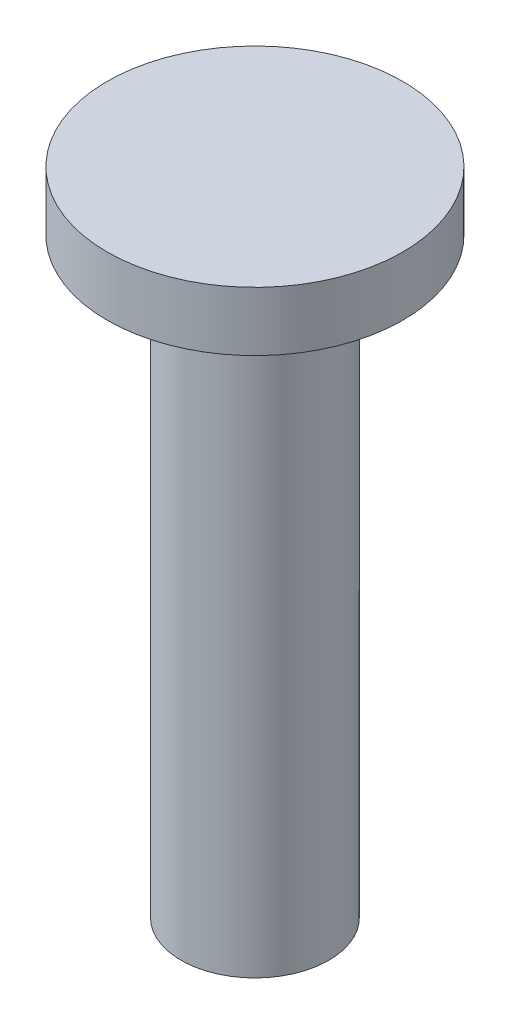
ISO-10303-21;
HEADER;
FILE_DESCRIPTION(('STEP AP214'),'2;1');
FILE_NAME('part.step','',(''),(''),'','','');
FILE_SCHEMA(('AUTOMOTIVE_DESIGN { 1 0 10303 214 1 1 1 1 }'));
ENDSEC;
DATA;
#1=APPLICATION_CONTEXT('core data for automotive mechanical design processes');
#2=APPLICATION_PROTOCOL_DEFINITION('international standard','automotive_design',2000,#1);
#3=PRODUCT_CONTEXT('',#1,'mechanical');
#4=PRODUCT('Part','Part','',(#3));
#5=PRODUCT_RELATED_PRODUCT_CATEGORY('part','',(#4));
#6=PRODUCT_DEFINITION_FORMATION('','',#4);
#7=PRODUCT_DEFINITION_CONTEXT('part definition',#1,'design');
#8=PRODUCT_DEFINITION('design','',#6,#7);
#9=PRODUCT_DEFINITION_SHAPE('','',#8);
#10=(LENGTH_UNIT() NAMED_UNIT(*) SI_UNIT(.MILLI.,.METRE.));
#11=(NAMED_UNIT(*) PLANE_ANGLE_UNIT() SI_UNIT($,.RADIAN.));
#12=(NAMED_UNIT(*) SI_UNIT($,.STERADIAN.) SOLID_ANGLE_UNIT());
#13=UNCERTAINTY_MEASURE_WITH_UNIT(LENGTH_MEASURE(1.E-05),#10,'distance_accuracy_value','');
#14=(GEOMETRIC_REPRESENTATION_CONTEXT(3) GLOBAL_UNCERTAINTY_ASSIGNED_CONTEXT((#13)) GLOBAL_UNIT_ASSIGNED_CONTEXT((#10,
#11,#12)) REPRESENTATION_CONTEXT('',''));
#15=CARTESIAN_POINT('',(0.,0.,0.));
#16=DIRECTION('',(0.,0.,1.));
#17=DIRECTION('',(1.,0.,0.));
#18=AXIS2_PLACEMENT_3D('',#15,#16,#17);
#19=CARTESIAN_POINT('',(0.,0.8,0.));
#20=DIRECTION('',(0.,-1.,0.));
#21=DIRECTION('',(0.,0.,-1.));
#22=AXIS2_PLACEMENT_3D('',#19,#20,#21);
#23=CYLINDRICAL_SURFACE('',#22,2.);
#24=CARTESIAN_POINT('',(0.,0.8,0.));
#25=DIRECTION('',(0.,1.,0.));
#26=DIRECTION('',(0.,0.,1.));
#27=AXIS2_PLACEMENT_3D('',#24,#25,#26);
#28=CIRCLE('',#27,2.);
#29=CARTESIAN_POINT('',(0.,0.8,2.));
#30=VERTEX_POINT('',#29);
#31=EDGE_CURVE('E46',#30,#30,#28,.T.);
#32=ORIENTED_EDGE('',*,*,#31,.F.);
#33=EDGE_LOOP('',(#32));
#34=FACE_BOUND('',#33,.T.);
#35=CARTESIAN_POINT('',(0.,0.,0.));
#36=DIRECTION('',(0.,1.,0.));
#37=DIRECTION('',(0.,0.,1.));
#38=AXIS2_PLACEMENT_3D('',#35,#36,#37);
#39=CIRCLE('',#38,2.);
#40=CARTESIAN_POINT('',(0.,0.,2.));
#41=VERTEX_POINT('',#40);
#42=EDGE_CURVE('E42',#41,#41,#39,.T.);
#43=ORIENTED_EDGE('',*,*,#42,.T.);
#44=EDGE_LOOP('',(#43));
#45=FACE_BOUND('',#44,.T.);
#46=ADVANCED_FACE('F39',(#34,#45),#23,.T.);
#47=CARTESIAN_POINT('',(0.,0.8,0.));
#48=DIRECTION('',(0.,1.,0.));
#49=DIRECTION('',(0.,0.,1.));
#50=AXIS2_PLACEMENT_3D('',#47,#48,#49);
#51=PLANE('',#50);
#52=ORIENTED_EDGE('',*,*,#31,.T.);
#53=EDGE_LOOP('',(#52));
#54=FACE_BOUND('',#53,.T.);
#55=ADVANCED_FACE('F63',(#54),#51,.T.);
#56=CARTESIAN_POINT('',(0.,0.,0.));
#57=DIRECTION('',(0.,1.,0.));
#58=DIRECTION('',(0.,0.,1.));
#59=AXIS2_PLACEMENT_3D('',#56,#57,#58);
#60=PLANE('',#59);
#61=CARTESIAN_POINT('',(0.,0.,0.));
#62=DIRECTION('',(0.,-1.,0.));
#63=DIRECTION('',(0.,0.,-1.));
#64=AXIS2_PLACEMENT_3D('',#61,#62,#63);
#65=CIRCLE('',#64,1.);
#66=CARTESIAN_POINT('',(0.,0.,-1.));
#67=VERTEX_POINT('',#66);
#68=EDGE_CURVE('E10',#67,#67,#65,.T.);
#69=ORIENTED_EDGE('',*,*,#68,.F.);
#70=EDGE_LOOP('',(#69));
#71=FACE_BOUND('',#70,.T.);
#72=ORIENTED_EDGE('',*,*,#42,.F.);
#73=EDGE_LOOP('',(#72));
#74=FACE_BOUND('',#73,.T.);
#75=ADVANCED_FACE('F60',(#71,#74),#60,.F.);
#76=CARTESIAN_POINT('',(0.,-8.,0.));
#77=DIRECTION('',(0.,1.,0.));
#78=DIRECTION('',(0.,0.,1.));
#79=AXIS2_PLACEMENT_3D('',#76,#77,#78);
#80=CYLINDRICAL_SURFACE('',#79,1.);
#81=CARTESIAN_POINT('',(0.,-8.,0.));
#82=DIRECTION('',(0.,-1.,0.));
#83=DIRECTION('',(0.,0.,-1.));
#84=AXIS2_PLACEMENT_3D('',#81,#82,#83);
#85=CIRCLE('',#84,1.);
#86=CARTESIAN_POINT('',(0.,-8.,-1.));
#87=VERTEX_POINT('',#86);
#88=EDGE_CURVE('E52',#87,#87,#85,.T.);
#89=ORIENTED_EDGE('',*,*,#88,.F.);
#90=EDGE_LOOP('',(#89));
#91=FACE_BOUND('',#90,.T.);
#92=ORIENTED_EDGE('',*,*,#68,.T.);
#93=EDGE_LOOP('',(#92));
#94=FACE_BOUND('',#93,.T.);
#95=ADVANCED_FACE('F62',(#91,#94),#80,.T.);
#96=CARTESIAN_POINT('',(0.,-8.,0.));
#97=DIRECTION('',(0.,-1.,0.));
#98=DIRECTION('',(0.,0.,-1.));
#99=AXIS2_PLACEMENT_3D('',#96,#97,#98);
#100=PLANE('',#99);
#101=ORIENTED_EDGE('',*,*,#88,.T.);
#102=EDGE_LOOP('',(#101));
#103=FACE_BOUND('',#102,.T.);
#104=ADVANCED_FACE('F69',(#103),#100,.T.);
#105=CLOSED_SHELL('',(#46,#55,#75,#95,#104));
#106=MANIFOLD_SOLID_BREP('B2',#105);
#107=ADVANCED_BREP_SHAPE_REPRESENTATION('',(#18,#106),#14);
#108=SHAPE_DEFINITION_REPRESENTATION(#9,#107);
ENDSEC;
END-ISO-10303-21;
